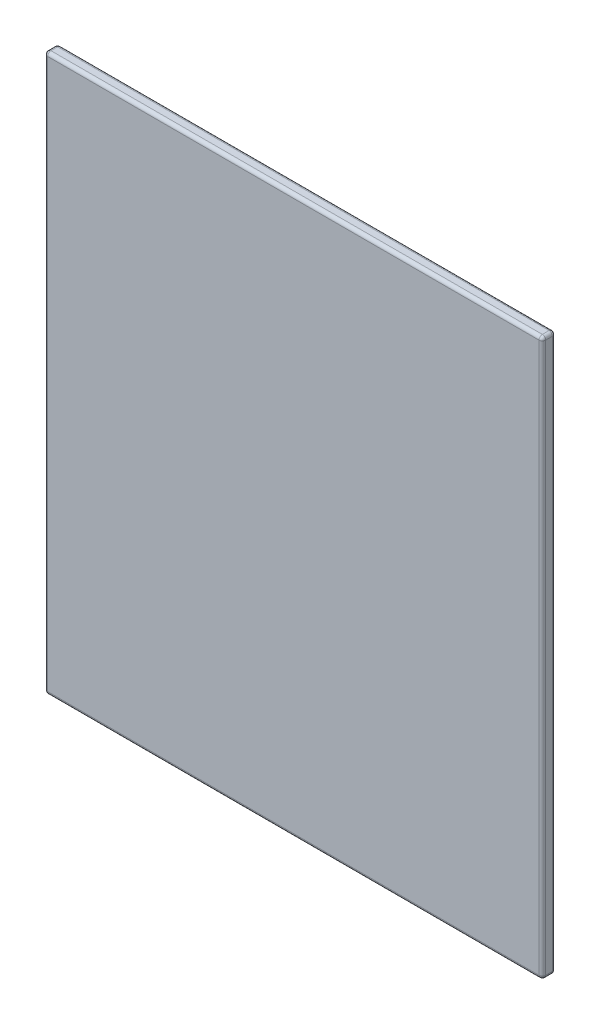
ISO-10303-21;
HEADER;
FILE_DESCRIPTION(('STEP AP214'),'2;1');
FILE_NAME('part.step','',(''),(''),'','','');
FILE_SCHEMA(('AUTOMOTIVE_DESIGN { 1 0 10303 214 1 1 1 1 }'));
ENDSEC;
DATA;
#1=APPLICATION_CONTEXT('core data for automotive mechanical design processes');
#2=APPLICATION_PROTOCOL_DEFINITION('international standard','automotive_design',2000,#1);
#3=PRODUCT_CONTEXT('',#1,'mechanical');
#4=PRODUCT('Part','Part','',(#3));
#5=PRODUCT_RELATED_PRODUCT_CATEGORY('part','',(#4));
#6=PRODUCT_DEFINITION_FORMATION('','',#4);
#7=PRODUCT_DEFINITION_CONTEXT('part definition',#1,'design');
#8=PRODUCT_DEFINITION('design','',#6,#7);
#9=PRODUCT_DEFINITION_SHAPE('','',#8);
#10=(LENGTH_UNIT() NAMED_UNIT(*) SI_UNIT(.MILLI.,.METRE.));
#11=(NAMED_UNIT(*) PLANE_ANGLE_UNIT() SI_UNIT($,.RADIAN.));
#12=(NAMED_UNIT(*) SI_UNIT($,.STERADIAN.) SOLID_ANGLE_UNIT());
#13=UNCERTAINTY_MEASURE_WITH_UNIT(LENGTH_MEASURE(1.E-05),#10,'distance_accuracy_value','');
#14=(GEOMETRIC_REPRESENTATION_CONTEXT(3) GLOBAL_UNCERTAINTY_ASSIGNED_CONTEXT((#13)) GLOBAL_UNIT_ASSIGNED_CONTEXT((#10,
#11,#12)) REPRESENTATION_CONTEXT('',''));
#15=CARTESIAN_POINT('',(0.,0.,0.));
#16=DIRECTION('',(0.,0.,1.));
#17=DIRECTION('',(1.,0.,0.));
#18=AXIS2_PLACEMENT_3D('',#15,#16,#17);
#19=CARTESIAN_POINT('',(37.35,-41.75,2.));
#20=DIRECTION('',(-1.,0.,0.));
#21=DIRECTION('',(0.,0.,1.));
#22=AXIS2_PLACEMENT_3D('',#19,#20,#21);
#23=PLANE('',#22);
#24=DIRECTION('',(0.,1.,0.));
#25=VECTOR('',#24,1.);
#26=CARTESIAN_POINT('',(37.35,-41.75,1.5));
#27=LINE('',#26,#25);
#28=CARTESIAN_POINT('',(37.35,41.25,1.5));
#29=VERTEX_POINT('',#28);
#30=CARTESIAN_POINT('',(37.35,-41.25,1.5));
#31=VERTEX_POINT('',#30);
#32=EDGE_CURVE('E42',#29,#31,#27,.F.);
#33=ORIENTED_EDGE('',*,*,#32,.T.);
#34=DIRECTION('',(0.,0.,-1.));
#35=VECTOR('',#34,1.);
#36=CARTESIAN_POINT('',(37.35,-41.25,2.));
#37=LINE('',#36,#35);
#38=CARTESIAN_POINT('',(37.35,-41.25,0.5));
#39=VERTEX_POINT('',#38);
#40=EDGE_CURVE('E11',#31,#39,#37,.T.);
#41=ORIENTED_EDGE('',*,*,#40,.T.);
#42=DIRECTION('',(0.,1.,0.));
#43=VECTOR('',#42,1.);
#44=CARTESIAN_POINT('',(37.35,41.75,0.5));
#45=LINE('',#44,#43);
#46=CARTESIAN_POINT('',(37.35,41.25,0.5));
#47=VERTEX_POINT('',#46);
#48=EDGE_CURVE('E194',#39,#47,#45,.T.);
#49=ORIENTED_EDGE('',*,*,#48,.T.);
#50=DIRECTION('',(0.,0.,-1.));
#51=VECTOR('',#50,1.);
#52=CARTESIAN_POINT('',(37.35,41.25,2.));
#53=LINE('',#52,#51);
#54=EDGE_CURVE('E53',#47,#29,#53,.F.);
#55=ORIENTED_EDGE('',*,*,#54,.T.);
#56=EDGE_LOOP('',(#33,#41,#49,#55));
#57=FACE_BOUND('',#56,.T.);
#58=ADVANCED_FACE('F33',(#57),#23,.F.);
#59=CARTESIAN_POINT('',(-37.35,41.75,2.));
#60=DIRECTION('',(0.,-1.,0.));
#61=DIRECTION('',(0.,0.,-1.));
#62=AXIS2_PLACEMENT_3D('',#59,#60,#61);
#63=PLANE('',#62);
#64=DIRECTION('',(0.,0.,-1.));
#65=VECTOR('',#64,1.);
#66=CARTESIAN_POINT('',(-36.85,41.75,2.));
#67=LINE('',#66,#65);
#68=CARTESIAN_POINT('',(-36.85,41.75,0.5));
#69=VERTEX_POINT('',#68);
#70=CARTESIAN_POINT('',(-36.85,41.75,1.5));
#71=VERTEX_POINT('',#70);
#72=EDGE_CURVE('E189',#69,#71,#67,.F.);
#73=ORIENTED_EDGE('',*,*,#72,.T.);
#74=DIRECTION('',(-1.,0.,0.));
#75=VECTOR('',#74,1.);
#76=CARTESIAN_POINT('',(-37.35,41.75,1.5));
#77=LINE('',#76,#75);
#78=CARTESIAN_POINT('',(36.85,41.75,1.5));
#79=VERTEX_POINT('',#78);
#80=EDGE_CURVE('E191',#71,#79,#77,.F.);
#81=ORIENTED_EDGE('',*,*,#80,.T.);
#82=DIRECTION('',(0.,0.,-1.));
#83=VECTOR('',#82,1.);
#84=CARTESIAN_POINT('',(36.85,41.75,2.));
#85=LINE('',#84,#83);
#86=CARTESIAN_POINT('',(36.85,41.75,0.5));
#87=VERTEX_POINT('',#86);
#88=EDGE_CURVE('E185',#79,#87,#85,.T.);
#89=ORIENTED_EDGE('',*,*,#88,.T.);
#90=DIRECTION('',(-1.,0.,0.));
#91=VECTOR('',#90,1.);
#92=CARTESIAN_POINT('',(-37.35,41.75,0.5));
#93=LINE('',#92,#91);
#94=EDGE_CURVE('E187',#87,#69,#93,.T.);
#95=ORIENTED_EDGE('',*,*,#94,.T.);
#96=EDGE_LOOP('',(#73,#81,#89,#95));
#97=FACE_BOUND('',#96,.T.);
#98=ADVANCED_FACE('F278',(#97),#63,.F.);
#99=CARTESIAN_POINT('',(-37.35,-41.75,2.));
#100=DIRECTION('',(1.,0.,0.));
#101=DIRECTION('',(0.,0.,-1.));
#102=AXIS2_PLACEMENT_3D('',#99,#100,#101);
#103=PLANE('',#102);
#104=DIRECTION('',(0.,0.,-1.));
#105=VECTOR('',#104,1.);
#106=CARTESIAN_POINT('',(-37.35,-41.25,2.));
#107=LINE('',#106,#105);
#108=CARTESIAN_POINT('',(-37.35,-41.25,0.5));
#109=VERTEX_POINT('',#108);
#110=CARTESIAN_POINT('',(-37.35,-41.25,1.5));
#111=VERTEX_POINT('',#110);
#112=EDGE_CURVE('E180',#109,#111,#107,.F.);
#113=ORIENTED_EDGE('',*,*,#112,.T.);
#114=DIRECTION('',(0.,-1.,0.));
#115=VECTOR('',#114,1.);
#116=CARTESIAN_POINT('',(-37.35,-41.75,1.5));
#117=LINE('',#116,#115);
#118=CARTESIAN_POINT('',(-37.35,41.25,1.5));
#119=VERTEX_POINT('',#118);
#120=EDGE_CURVE('E182',#111,#119,#117,.F.);
#121=ORIENTED_EDGE('',*,*,#120,.T.);
#122=DIRECTION('',(0.,0.,-1.));
#123=VECTOR('',#122,1.);
#124=CARTESIAN_POINT('',(-37.35,41.25,2.));
#125=LINE('',#124,#123);
#126=CARTESIAN_POINT('',(-37.35,41.25,0.5));
#127=VERTEX_POINT('',#126);
#128=EDGE_CURVE('E176',#119,#127,#125,.T.);
#129=ORIENTED_EDGE('',*,*,#128,.T.);
#130=DIRECTION('',(0.,-1.,0.));
#131=VECTOR('',#130,1.);
#132=CARTESIAN_POINT('',(-37.35,-41.75,0.5));
#133=LINE('',#132,#131);
#134=EDGE_CURVE('E178',#127,#109,#133,.T.);
#135=ORIENTED_EDGE('',*,*,#134,.T.);
#136=EDGE_LOOP('',(#113,#121,#129,#135));
#137=FACE_BOUND('',#136,.T.);
#138=ADVANCED_FACE('F269',(#137),#103,.F.);
#139=CARTESIAN_POINT('',(-37.35,-41.75,2.));
#140=DIRECTION('',(0.,1.,0.));
#141=DIRECTION('',(0.,0.,1.));
#142=AXIS2_PLACEMENT_3D('',#139,#140,#141);
#143=PLANE('',#142);
#144=DIRECTION('',(1.,0.,0.));
#145=VECTOR('',#144,1.);
#146=CARTESIAN_POINT('',(-37.35,-41.75,1.5));
#147=LINE('',#146,#145);
#148=CARTESIAN_POINT('',(36.85,-41.75,1.5));
#149=VERTEX_POINT('',#148);
#150=CARTESIAN_POINT('',(-36.85,-41.75,1.5));
#151=VERTEX_POINT('',#150);
#152=EDGE_CURVE('E129',#149,#151,#147,.F.);
#153=ORIENTED_EDGE('',*,*,#152,.T.);
#154=DIRECTION('',(0.,0.,-1.));
#155=VECTOR('',#154,1.);
#156=CARTESIAN_POINT('',(-36.85,-41.75,2.));
#157=LINE('',#156,#155);
#158=CARTESIAN_POINT('',(-36.85,-41.75,0.5));
#159=VERTEX_POINT('',#158);
#160=EDGE_CURVE('E165',#151,#159,#157,.T.);
#161=ORIENTED_EDGE('',*,*,#160,.T.);
#162=DIRECTION('',(1.,0.,0.));
#163=VECTOR('',#162,1.);
#164=CARTESIAN_POINT('',(37.35,-41.75,0.5));
#165=LINE('',#164,#163);
#166=CARTESIAN_POINT('',(36.85,-41.75,0.5));
#167=VERTEX_POINT('',#166);
#168=EDGE_CURVE('E158',#159,#167,#165,.T.);
#169=ORIENTED_EDGE('',*,*,#168,.T.);
#170=DIRECTION('',(0.,0.,-1.));
#171=VECTOR('',#170,1.);
#172=CARTESIAN_POINT('',(36.85,-41.75,2.));
#173=LINE('',#172,#171);
#174=EDGE_CURVE('E156',#167,#149,#173,.F.);
#175=ORIENTED_EDGE('',*,*,#174,.T.);
#176=EDGE_LOOP('',(#153,#161,#169,#175));
#177=FACE_BOUND('',#176,.T.);
#178=ADVANCED_FACE('F356',(#177),#143,.F.);
#179=CARTESIAN_POINT('',(0.,0.,2.));
#180=DIRECTION('',(0.,0.,-1.));
#181=DIRECTION('',(-1.,0.,0.));
#182=AXIS2_PLACEMENT_3D('',#179,#180,#181);
#183=PLANE('',#182);
#184=DIRECTION('',(0.,-1.,0.));
#185=VECTOR('',#184,1.);
#186=CARTESIAN_POINT('',(-36.85,0.,2.));
#187=LINE('',#186,#185);
#188=CARTESIAN_POINT('',(-36.85,41.25,2.));
#189=VERTEX_POINT('',#188);
#190=CARTESIAN_POINT('',(-36.85,-41.25,2.));
#191=VERTEX_POINT('',#190);
#192=EDGE_CURVE('E154',#189,#191,#187,.T.);
#193=ORIENTED_EDGE('',*,*,#192,.T.);
#194=DIRECTION('',(1.,0.,0.));
#195=VECTOR('',#194,1.);
#196=CARTESIAN_POINT('',(0.,-41.25,2.));
#197=LINE('',#196,#195);
#198=CARTESIAN_POINT('',(36.85,-41.25,2.));
#199=VERTEX_POINT('',#198);
#200=EDGE_CURVE('E127',#191,#199,#197,.T.);
#201=ORIENTED_EDGE('',*,*,#200,.T.);
#202=DIRECTION('',(0.,1.,0.));
#203=VECTOR('',#202,1.);
#204=CARTESIAN_POINT('',(36.85,0.,2.));
#205=LINE('',#204,#203);
#206=CARTESIAN_POINT('',(36.85,41.25,2.));
#207=VERTEX_POINT('',#206);
#208=EDGE_CURVE('E144',#199,#207,#205,.T.);
#209=ORIENTED_EDGE('',*,*,#208,.T.);
#210=DIRECTION('',(-1.,0.,0.));
#211=VECTOR('',#210,1.);
#212=CARTESIAN_POINT('',(0.,41.25,2.));
#213=LINE('',#212,#211);
#214=EDGE_CURVE('E150',#207,#189,#213,.T.);
#215=ORIENTED_EDGE('',*,*,#214,.T.);
#216=EDGE_LOOP('',(#193,#201,#209,#215));
#217=FACE_BOUND('',#216,.T.);
#218=ADVANCED_FACE('F152',(#217),#183,.F.);
#219=CARTESIAN_POINT('',(0.,0.,0.));
#220=DIRECTION('',(0.,0.,-1.));
#221=DIRECTION('',(-1.,0.,0.));
#222=AXIS2_PLACEMENT_3D('',#219,#220,#221);
#223=PLANE('',#222);
#224=DIRECTION('',(0.,1.,0.));
#225=VECTOR('',#224,1.);
#226=CARTESIAN_POINT('',(36.85,-41.75,0.));
#227=LINE('',#226,#225);
#228=CARTESIAN_POINT('',(36.85,41.25,0.));
#229=VERTEX_POINT('',#228);
#230=CARTESIAN_POINT('',(36.85,-41.25,0.));
#231=VERTEX_POINT('',#230);
#232=EDGE_CURVE('E167',#229,#231,#227,.F.);
#233=ORIENTED_EDGE('',*,*,#232,.T.);
#234=DIRECTION('',(1.,0.,0.));
#235=VECTOR('',#234,1.);
#236=CARTESIAN_POINT('',(-37.35,-41.25,0.));
#237=LINE('',#236,#235);
#238=CARTESIAN_POINT('',(-36.85,-41.25,0.));
#239=VERTEX_POINT('',#238);
#240=EDGE_CURVE('E173',#231,#239,#237,.F.);
#241=ORIENTED_EDGE('',*,*,#240,.T.);
#242=DIRECTION('',(0.,-1.,0.));
#243=VECTOR('',#242,1.);
#244=CARTESIAN_POINT('',(-36.85,41.75,0.));
#245=LINE('',#244,#243);
#246=CARTESIAN_POINT('',(-36.85,41.25,0.));
#247=VERTEX_POINT('',#246);
#248=EDGE_CURVE('E171',#239,#247,#245,.F.);
#249=ORIENTED_EDGE('',*,*,#248,.T.);
#250=DIRECTION('',(-1.,0.,0.));
#251=VECTOR('',#250,1.);
#252=CARTESIAN_POINT('',(37.35,41.25,0.));
#253=LINE('',#252,#251);
#254=EDGE_CURVE('E169',#247,#229,#253,.F.);
#255=ORIENTED_EDGE('',*,*,#254,.T.);
#256=EDGE_LOOP('',(#233,#241,#249,#255));
#257=FACE_BOUND('',#256,.T.);
#258=ADVANCED_FACE('F296',(#257),#223,.T.);
#259=CARTESIAN_POINT('',(-37.35,41.25,0.5));
#260=DIRECTION('',(1.,0.,0.));
#261=DIRECTION('',(0.,0.,-1.));
#262=AXIS2_PLACEMENT_3D('',#259,#260,#261);
#263=CYLINDRICAL_SURFACE('',#262,0.5);
#264=CARTESIAN_POINT('',(-36.85,41.25,0.5));
#265=DIRECTION('',(-1.,0.,0.));
#266=DIRECTION('',(0.,0.,1.));
#267=AXIS2_PLACEMENT_3D('',#264,#265,#266);
#268=CIRCLE('',#267,0.5);
#269=EDGE_CURVE('E37',#69,#247,#268,.T.);
#270=ORIENTED_EDGE('',*,*,#269,.F.);
#271=ORIENTED_EDGE('',*,*,#94,.F.);
#272=CARTESIAN_POINT('',(36.85,41.25,0.5));
#273=DIRECTION('',(1.,0.,0.));
#274=DIRECTION('',(0.,0.,-1.));
#275=AXIS2_PLACEMENT_3D('',#272,#273,#274);
#276=CIRCLE('',#275,0.5);
#277=EDGE_CURVE('E246',#229,#87,#276,.T.);
#278=ORIENTED_EDGE('',*,*,#277,.F.);
#279=ORIENTED_EDGE('',*,*,#254,.F.);
#280=EDGE_LOOP('',(#270,#271,#278,#279));
#281=FACE_BOUND('',#280,.T.);
#282=ADVANCED_FACE('F35',(#281),#263,.T.);
#283=CARTESIAN_POINT('',(-36.85,41.25,0.5));
#284=DIRECTION('',(0.,0.,1.));
#285=DIRECTION('',(1.,0.,0.));
#286=AXIS2_PLACEMENT_3D('',#283,#284,#285);
#287=SPHERICAL_SURFACE('',#286,0.5);
#288=CARTESIAN_POINT('',(-36.85,41.25,0.5));
#289=DIRECTION('',(0.,0.,-1.));
#290=DIRECTION('',(-1.,0.,0.));
#291=AXIS2_PLACEMENT_3D('',#288,#289,#290);
#292=CIRCLE('',#291,0.5);
#293=EDGE_CURVE('E241',#69,#127,#292,.F.);
#294=ORIENTED_EDGE('',*,*,#293,.F.);
#295=ORIENTED_EDGE('',*,*,#269,.T.);
#296=CARTESIAN_POINT('',(-36.85,41.25,0.5));
#297=DIRECTION('',(0.,1.,0.));
#298=DIRECTION('',(0.,0.,1.));
#299=AXIS2_PLACEMENT_3D('',#296,#297,#298);
#300=CIRCLE('',#299,0.5);
#301=EDGE_CURVE('E244',#127,#247,#300,.F.);
#302=ORIENTED_EDGE('',*,*,#301,.F.);
#303=EDGE_LOOP('',(#294,#295,#302));
#304=FACE_BOUND('',#303,.T.);
#305=ADVANCED_FACE('F257',(#304),#287,.T.);
#306=CARTESIAN_POINT('',(36.85,41.25,0.5));
#307=DIRECTION('',(0.,0.,1.));
#308=DIRECTION('',(1.,0.,0.));
#309=AXIS2_PLACEMENT_3D('',#306,#307,#308);
#310=SPHERICAL_SURFACE('',#309,0.5);
#311=CARTESIAN_POINT('',(36.85,41.25,0.5));
#312=DIRECTION('',(0.,1.,0.));
#313=DIRECTION('',(0.,0.,1.));
#314=AXIS2_PLACEMENT_3D('',#311,#312,#313);
#315=CIRCLE('',#314,0.5);
#316=EDGE_CURVE('E235',#229,#47,#315,.F.);
#317=ORIENTED_EDGE('',*,*,#316,.F.);
#318=ORIENTED_EDGE('',*,*,#277,.T.);
#319=CARTESIAN_POINT('',(36.85,41.25,0.5));
#320=DIRECTION('',(0.,0.,-1.));
#321=DIRECTION('',(-1.,0.,0.));
#322=AXIS2_PLACEMENT_3D('',#319,#320,#321);
#323=CIRCLE('',#322,0.5);
#324=EDGE_CURVE('E238',#47,#87,#323,.F.);
#325=ORIENTED_EDGE('',*,*,#324,.F.);
#326=EDGE_LOOP('',(#317,#318,#325));
#327=FACE_BOUND('',#326,.T.);
#328=ADVANCED_FACE('F289',(#327),#310,.T.);
#329=CARTESIAN_POINT('',(-36.85,-41.75,0.5));
#330=DIRECTION('',(0.,1.,0.));
#331=DIRECTION('',(0.,0.,1.));
#332=AXIS2_PLACEMENT_3D('',#329,#330,#331);
#333=CYLINDRICAL_SURFACE('',#332,0.5);
#334=ORIENTED_EDGE('',*,*,#301,.T.);
#335=ORIENTED_EDGE('',*,*,#248,.F.);
#336=CARTESIAN_POINT('',(-36.85,-41.25,0.5));
#337=DIRECTION('',(0.,-1.,0.));
#338=DIRECTION('',(0.,0.,-1.));
#339=AXIS2_PLACEMENT_3D('',#336,#337,#338);
#340=CIRCLE('',#339,0.5);
#341=EDGE_CURVE('E230',#109,#239,#340,.T.);
#342=ORIENTED_EDGE('',*,*,#341,.F.);
#343=ORIENTED_EDGE('',*,*,#134,.F.);
#344=EDGE_LOOP('',(#334,#335,#342,#343));
#345=FACE_BOUND('',#344,.T.);
#346=ADVANCED_FACE('F265',(#345),#333,.T.);
#347=CARTESIAN_POINT('',(-36.85,41.25,2.));
#348=DIRECTION('',(0.,0.,-1.));
#349=DIRECTION('',(-1.,0.,0.));
#350=AXIS2_PLACEMENT_3D('',#347,#348,#349);
#351=CYLINDRICAL_SURFACE('',#350,0.5);
#352=ORIENTED_EDGE('',*,*,#293,.T.);
#353=ORIENTED_EDGE('',*,*,#128,.F.);
#354=CARTESIAN_POINT('',(-36.85,41.25,1.5));
#355=DIRECTION('',(0.,0.,1.));
#356=DIRECTION('',(1.,0.,0.));
#357=AXIS2_PLACEMENT_3D('',#354,#355,#356);
#358=CIRCLE('',#357,0.5);
#359=EDGE_CURVE('E227',#71,#119,#358,.T.);
#360=ORIENTED_EDGE('',*,*,#359,.F.);
#361=ORIENTED_EDGE('',*,*,#72,.F.);
#362=EDGE_LOOP('',(#352,#353,#360,#361));
#363=FACE_BOUND('',#362,.T.);
#364=ADVANCED_FACE('F275',(#363),#351,.T.);
#365=CARTESIAN_POINT('',(0.,41.25,1.5));
#366=DIRECTION('',(-1.,0.,0.));
#367=DIRECTION('',(0.,0.,1.));
#368=AXIS2_PLACEMENT_3D('',#365,#366,#367);
#369=CYLINDRICAL_SURFACE('',#368,0.5);
#370=CARTESIAN_POINT('',(36.85,41.25,1.5));
#371=DIRECTION('',(1.,0.,0.));
#372=DIRECTION('',(0.,0.,-1.));
#373=AXIS2_PLACEMENT_3D('',#370,#371,#372);
#374=CIRCLE('',#373,0.5);
#375=EDGE_CURVE('E221',#79,#207,#374,.T.);
#376=ORIENTED_EDGE('',*,*,#375,.F.);
#377=ORIENTED_EDGE('',*,*,#80,.F.);
#378=CARTESIAN_POINT('',(-36.85,41.25,1.5));
#379=DIRECTION('',(-1.,0.,0.));
#380=DIRECTION('',(0.,0.,1.));
#381=AXIS2_PLACEMENT_3D('',#378,#379,#380);
#382=CIRCLE('',#381,0.5);
#383=EDGE_CURVE('E224',#189,#71,#382,.T.);
#384=ORIENTED_EDGE('',*,*,#383,.F.);
#385=ORIENTED_EDGE('',*,*,#214,.F.);
#386=EDGE_LOOP('',(#376,#377,#384,#385));
#387=FACE_BOUND('',#386,.T.);
#388=ADVANCED_FACE('F282',(#387),#369,.T.);
#389=CARTESIAN_POINT('',(36.85,41.25,2.));
#390=DIRECTION('',(0.,0.,-1.));
#391=DIRECTION('',(-1.,0.,0.));
#392=AXIS2_PLACEMENT_3D('',#389,#390,#391);
#393=CYLINDRICAL_SURFACE('',#392,0.5);
#394=ORIENTED_EDGE('',*,*,#324,.T.);
#395=ORIENTED_EDGE('',*,*,#88,.F.);
#396=CARTESIAN_POINT('',(36.85,41.25,1.5));
#397=DIRECTION('',(0.,0.,1.));
#398=DIRECTION('',(1.,0.,0.));
#399=AXIS2_PLACEMENT_3D('',#396,#397,#398);
#400=CIRCLE('',#399,0.5);
#401=EDGE_CURVE('E219',#29,#79,#400,.T.);
#402=ORIENTED_EDGE('',*,*,#401,.F.);
#403=ORIENTED_EDGE('',*,*,#54,.F.);
#404=EDGE_LOOP('',(#394,#395,#402,#403));
#405=FACE_BOUND('',#404,.T.);
#406=ADVANCED_FACE('F287',(#405),#393,.T.);
#407=CARTESIAN_POINT('',(36.85,-41.75,0.5));
#408=DIRECTION('',(0.,-1.,0.));
#409=DIRECTION('',(0.,0.,-1.));
#410=AXIS2_PLACEMENT_3D('',#407,#408,#409);
#411=CYLINDRICAL_SURFACE('',#410,0.5);
#412=ORIENTED_EDGE('',*,*,#316,.T.);
#413=ORIENTED_EDGE('',*,*,#48,.F.);
#414=CARTESIAN_POINT('',(36.85,-41.25,0.5));
#415=DIRECTION('',(0.,-1.,0.));
#416=DIRECTION('',(0.,0.,-1.));
#417=AXIS2_PLACEMENT_3D('',#414,#415,#416);
#418=CIRCLE('',#417,0.5);
#419=EDGE_CURVE('E216',#231,#39,#418,.T.);
#420=ORIENTED_EDGE('',*,*,#419,.F.);
#421=ORIENTED_EDGE('',*,*,#232,.F.);
#422=EDGE_LOOP('',(#412,#413,#420,#421));
#423=FACE_BOUND('',#422,.T.);
#424=ADVANCED_FACE('F293',(#423),#411,.T.);
#425=CARTESIAN_POINT('',(-37.35,-41.25,0.5));
#426=DIRECTION('',(-1.,0.,0.));
#427=DIRECTION('',(0.,0.,1.));
#428=AXIS2_PLACEMENT_3D('',#425,#426,#427);
#429=CYLINDRICAL_SURFACE('',#428,0.5);
#430=CARTESIAN_POINT('',(-36.85,-41.25,0.5));
#431=DIRECTION('',(-1.,0.,0.));
#432=DIRECTION('',(0.,0.,1.));
#433=AXIS2_PLACEMENT_3D('',#430,#431,#432);
#434=CIRCLE('',#433,0.5);
#435=EDGE_CURVE('E232',#239,#159,#434,.T.);
#436=ORIENTED_EDGE('',*,*,#435,.F.);
#437=ORIENTED_EDGE('',*,*,#240,.F.);
#438=CARTESIAN_POINT('',(36.85,-41.25,0.5));
#439=DIRECTION('',(1.,0.,0.));
#440=DIRECTION('',(0.,0.,-1.));
#441=AXIS2_PLACEMENT_3D('',#438,#439,#440);
#442=CIRCLE('',#441,0.5);
#443=EDGE_CURVE('E213',#167,#231,#442,.T.);
#444=ORIENTED_EDGE('',*,*,#443,.F.);
#445=ORIENTED_EDGE('',*,*,#168,.F.);
#446=EDGE_LOOP('',(#436,#437,#444,#445));
#447=FACE_BOUND('',#446,.T.);
#448=ADVANCED_FACE('F300',(#447),#429,.T.);
#449=CARTESIAN_POINT('',(-36.85,-41.25,0.5));
#450=DIRECTION('',(0.,0.,1.));
#451=DIRECTION('',(1.,0.,0.));
#452=AXIS2_PLACEMENT_3D('',#449,#450,#451);
#453=SPHERICAL_SURFACE('',#452,0.5);
#454=ORIENTED_EDGE('',*,*,#341,.T.);
#455=ORIENTED_EDGE('',*,*,#435,.T.);
#456=CARTESIAN_POINT('',(-36.85,-41.25,0.5));
#457=DIRECTION('',(0.,0.,-1.));
#458=DIRECTION('',(-1.,0.,0.));
#459=AXIS2_PLACEMENT_3D('',#456,#457,#458);
#460=CIRCLE('',#459,0.5);
#461=EDGE_CURVE('E210',#109,#159,#460,.F.);
#462=ORIENTED_EDGE('',*,*,#461,.F.);
#463=EDGE_LOOP('',(#454,#455,#462));
#464=FACE_BOUND('',#463,.T.);
#465=ADVANCED_FACE('F304',(#464),#453,.T.);
#466=CARTESIAN_POINT('',(-36.85,41.25,1.5));
#467=DIRECTION('',(0.,0.,1.));
#468=DIRECTION('',(1.,0.,0.));
#469=AXIS2_PLACEMENT_3D('',#466,#467,#468);
#470=SPHERICAL_SURFACE('',#469,0.5);
#471=ORIENTED_EDGE('',*,*,#383,.T.);
#472=ORIENTED_EDGE('',*,*,#359,.T.);
#473=CARTESIAN_POINT('',(-36.85,41.25,1.5));
#474=DIRECTION('',(0.,1.,0.));
#475=DIRECTION('',(0.,0.,1.));
#476=AXIS2_PLACEMENT_3D('',#473,#474,#475);
#477=CIRCLE('',#476,0.5);
#478=EDGE_CURVE('E208',#189,#119,#477,.F.);
#479=ORIENTED_EDGE('',*,*,#478,.F.);
#480=EDGE_LOOP('',(#471,#472,#479));
#481=FACE_BOUND('',#480,.T.);
#482=ADVANCED_FACE('F315',(#481),#470,.T.);
#483=CARTESIAN_POINT('',(36.85,41.25,1.5));
#484=DIRECTION('',(0.,0.,1.));
#485=DIRECTION('',(1.,0.,0.));
#486=AXIS2_PLACEMENT_3D('',#483,#484,#485);
#487=SPHERICAL_SURFACE('',#486,0.5);
#488=ORIENTED_EDGE('',*,*,#401,.T.);
#489=ORIENTED_EDGE('',*,*,#375,.T.);
#490=CARTESIAN_POINT('',(36.85,41.25,1.5));
#491=DIRECTION('',(0.,1.,0.));
#492=DIRECTION('',(0.,0.,1.));
#493=AXIS2_PLACEMENT_3D('',#490,#491,#492);
#494=CIRCLE('',#493,0.5);
#495=EDGE_CURVE('E147',#29,#207,#494,.F.);
#496=ORIENTED_EDGE('',*,*,#495,.F.);
#497=EDGE_LOOP('',(#488,#489,#496));
#498=FACE_BOUND('',#497,.T.);
#499=ADVANCED_FACE('F317',(#498),#487,.T.);
#500=CARTESIAN_POINT('',(36.85,-41.25,0.5));
#501=DIRECTION('',(0.,0.,1.));
#502=DIRECTION('',(1.,0.,0.));
#503=AXIS2_PLACEMENT_3D('',#500,#501,#502);
#504=SPHERICAL_SURFACE('',#503,0.5);
#505=ORIENTED_EDGE('',*,*,#443,.T.);
#506=ORIENTED_EDGE('',*,*,#419,.T.);
#507=CARTESIAN_POINT('',(36.85,-41.25,0.5));
#508=DIRECTION('',(0.,0.,-1.));
#509=DIRECTION('',(-1.,0.,0.));
#510=AXIS2_PLACEMENT_3D('',#507,#508,#509);
#511=CIRCLE('',#510,0.5);
#512=EDGE_CURVE('E205',#167,#39,#511,.F.);
#513=ORIENTED_EDGE('',*,*,#512,.F.);
#514=EDGE_LOOP('',(#505,#506,#513));
#515=FACE_BOUND('',#514,.T.);
#516=ADVANCED_FACE('F323',(#515),#504,.T.);
#517=CARTESIAN_POINT('',(-36.85,-41.25,2.));
#518=DIRECTION('',(0.,0.,-1.));
#519=DIRECTION('',(-1.,0.,0.));
#520=AXIS2_PLACEMENT_3D('',#517,#518,#519);
#521=CYLINDRICAL_SURFACE('',#520,0.5);
#522=ORIENTED_EDGE('',*,*,#461,.T.);
#523=ORIENTED_EDGE('',*,*,#160,.F.);
#524=CARTESIAN_POINT('',(-36.85,-41.25,1.5));
#525=DIRECTION('',(0.,0.,1.));
#526=DIRECTION('',(1.,0.,0.));
#527=AXIS2_PLACEMENT_3D('',#524,#525,#526);
#528=CIRCLE('',#527,0.5);
#529=EDGE_CURVE('E202',#111,#151,#528,.T.);
#530=ORIENTED_EDGE('',*,*,#529,.F.);
#531=ORIENTED_EDGE('',*,*,#112,.F.);
#532=EDGE_LOOP('',(#522,#523,#530,#531));
#533=FACE_BOUND('',#532,.T.);
#534=ADVANCED_FACE('F307',(#533),#521,.T.);
#535=CARTESIAN_POINT('',(-36.85,0.,1.5));
#536=DIRECTION('',(0.,-1.,0.));
#537=DIRECTION('',(0.,0.,-1.));
#538=AXIS2_PLACEMENT_3D('',#535,#536,#537);
#539=CYLINDRICAL_SURFACE('',#538,0.5);
#540=ORIENTED_EDGE('',*,*,#478,.T.);
#541=ORIENTED_EDGE('',*,*,#120,.F.);
#542=CARTESIAN_POINT('',(-36.85,-41.25,1.5));
#543=DIRECTION('',(0.,-1.,0.));
#544=DIRECTION('',(0.,0.,-1.));
#545=AXIS2_PLACEMENT_3D('',#542,#543,#544);
#546=CIRCLE('',#545,0.5);
#547=EDGE_CURVE('E141',#191,#111,#546,.T.);
#548=ORIENTED_EDGE('',*,*,#547,.F.);
#549=ORIENTED_EDGE('',*,*,#192,.F.);
#550=EDGE_LOOP('',(#540,#541,#548,#549));
#551=FACE_BOUND('',#550,.T.);
#552=ADVANCED_FACE('F313',(#551),#539,.T.);
#553=CARTESIAN_POINT('',(36.85,0.,1.5));
#554=DIRECTION('',(0.,1.,0.));
#555=DIRECTION('',(0.,0.,1.));
#556=AXIS2_PLACEMENT_3D('',#553,#554,#555);
#557=CYLINDRICAL_SURFACE('',#556,0.5);
#558=ORIENTED_EDGE('',*,*,#495,.T.);
#559=ORIENTED_EDGE('',*,*,#208,.F.);
#560=CARTESIAN_POINT('',(36.85,-41.25,1.5));
#561=DIRECTION('',(0.,-1.,0.));
#562=DIRECTION('',(0.,0.,-1.));
#563=AXIS2_PLACEMENT_3D('',#560,#561,#562);
#564=CIRCLE('',#563,0.5);
#565=EDGE_CURVE('E135',#31,#199,#564,.T.);
#566=ORIENTED_EDGE('',*,*,#565,.F.);
#567=ORIENTED_EDGE('',*,*,#32,.F.);
#568=EDGE_LOOP('',(#558,#559,#566,#567));
#569=FACE_BOUND('',#568,.T.);
#570=ADVANCED_FACE('F145',(#569),#557,.T.);
#571=CARTESIAN_POINT('',(36.85,-41.25,2.));
#572=DIRECTION('',(0.,0.,-1.));
#573=DIRECTION('',(-1.,0.,0.));
#574=AXIS2_PLACEMENT_3D('',#571,#572,#573);
#575=CYLINDRICAL_SURFACE('',#574,0.5);
#576=ORIENTED_EDGE('',*,*,#512,.T.);
#577=ORIENTED_EDGE('',*,*,#40,.F.);
#578=CARTESIAN_POINT('',(36.85,-41.25,1.5));
#579=DIRECTION('',(0.,0.,1.));
#580=DIRECTION('',(1.,0.,0.));
#581=AXIS2_PLACEMENT_3D('',#578,#579,#580);
#582=CIRCLE('',#581,0.5);
#583=EDGE_CURVE('E139',#149,#31,#582,.T.);
#584=ORIENTED_EDGE('',*,*,#583,.F.);
#585=ORIENTED_EDGE('',*,*,#174,.F.);
#586=EDGE_LOOP('',(#576,#577,#584,#585));
#587=FACE_BOUND('',#586,.T.);
#588=ADVANCED_FACE('F340',(#587),#575,.T.);
#589=CARTESIAN_POINT('',(-36.85,-41.25,1.5));
#590=DIRECTION('',(0.,0.,1.));
#591=DIRECTION('',(1.,0.,0.));
#592=AXIS2_PLACEMENT_3D('',#589,#590,#591);
#593=SPHERICAL_SURFACE('',#592,0.5);
#594=ORIENTED_EDGE('',*,*,#547,.T.);
#595=ORIENTED_EDGE('',*,*,#529,.T.);
#596=CARTESIAN_POINT('',(-36.85,-41.25,1.5));
#597=DIRECTION('',(-1.,0.,0.));
#598=DIRECTION('',(0.,0.,1.));
#599=AXIS2_PLACEMENT_3D('',#596,#597,#598);
#600=CIRCLE('',#599,0.5);
#601=EDGE_CURVE('E132',#191,#151,#600,.F.);
#602=ORIENTED_EDGE('',*,*,#601,.F.);
#603=EDGE_LOOP('',(#594,#595,#602));
#604=FACE_BOUND('',#603,.T.);
#605=ADVANCED_FACE('F311',(#604),#593,.T.);
#606=CARTESIAN_POINT('',(36.85,-41.25,1.5));
#607=DIRECTION('',(0.,0.,1.));
#608=DIRECTION('',(1.,0.,0.));
#609=AXIS2_PLACEMENT_3D('',#606,#607,#608);
#610=SPHERICAL_SURFACE('',#609,0.5);
#611=ORIENTED_EDGE('',*,*,#583,.T.);
#612=ORIENTED_EDGE('',*,*,#565,.T.);
#613=CARTESIAN_POINT('',(36.85,-41.25,1.5));
#614=DIRECTION('',(1.,0.,0.));
#615=DIRECTION('',(0.,0.,-1.));
#616=AXIS2_PLACEMENT_3D('',#613,#614,#615);
#617=CIRCLE('',#616,0.5);
#618=EDGE_CURVE('E123',#149,#199,#617,.F.);
#619=ORIENTED_EDGE('',*,*,#618,.F.);
#620=EDGE_LOOP('',(#611,#612,#619));
#621=FACE_BOUND('',#620,.T.);
#622=ADVANCED_FACE('F137',(#621),#610,.T.);
#623=CARTESIAN_POINT('',(0.,-41.25,1.5));
#624=DIRECTION('',(1.,0.,0.));
#625=DIRECTION('',(0.,0.,-1.));
#626=AXIS2_PLACEMENT_3D('',#623,#624,#625);
#627=CYLINDRICAL_SURFACE('',#626,0.5);
#628=ORIENTED_EDGE('',*,*,#601,.T.);
#629=ORIENTED_EDGE('',*,*,#152,.F.);
#630=ORIENTED_EDGE('',*,*,#618,.T.);
#631=ORIENTED_EDGE('',*,*,#200,.F.);
#632=EDGE_LOOP('',(#628,#629,#630,#631));
#633=FACE_BOUND('',#632,.T.);
#634=ADVANCED_FACE('F125',(#633),#627,.T.);
#635=CLOSED_SHELL('',(#58,#98,#138,#178,#218,#258,#282,#305,#328,#346,#364,#388,#406,#424,#448,
#465,#482,#499,#516,#534,#552,#570,#588,#605,#622,#634));
#636=MANIFOLD_SOLID_BREP('B2',#635);
#637=ADVANCED_BREP_SHAPE_REPRESENTATION('',(#18,#636),#14);
#638=SHAPE_DEFINITION_REPRESENTATION(#9,#637);
ENDSEC;
END-ISO-10303-21;
